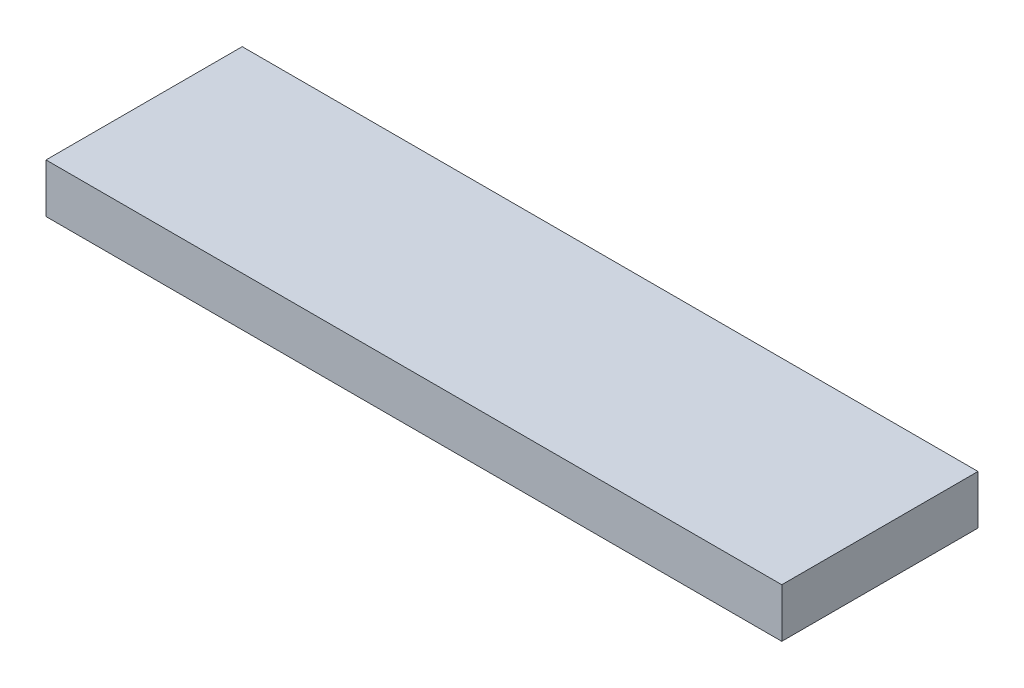
ISO-10303-21;
HEADER;
FILE_DESCRIPTION(('STEP AP214'),'2;1');
FILE_NAME('part.step','',(''),(''),'','','');
FILE_SCHEMA(('AUTOMOTIVE_DESIGN { 1 0 10303 214 1 1 1 1 }'));
ENDSEC;
DATA;
#1=APPLICATION_CONTEXT('core data for automotive mechanical design processes');
#2=APPLICATION_PROTOCOL_DEFINITION('international standard','automotive_design',2000,#1);
#3=PRODUCT_CONTEXT('',#1,'mechanical');
#4=PRODUCT('Part','Part','',(#3));
#5=PRODUCT_RELATED_PRODUCT_CATEGORY('part','',(#4));
#6=PRODUCT_DEFINITION_FORMATION('','',#4);
#7=PRODUCT_DEFINITION_CONTEXT('part definition',#1,'design');
#8=PRODUCT_DEFINITION('design','',#6,#7);
#9=PRODUCT_DEFINITION_SHAPE('','',#8);
#10=(LENGTH_UNIT() NAMED_UNIT(*) SI_UNIT(.MILLI.,.METRE.));
#11=(NAMED_UNIT(*) PLANE_ANGLE_UNIT() SI_UNIT($,.RADIAN.));
#12=(NAMED_UNIT(*) SI_UNIT($,.STERADIAN.) SOLID_ANGLE_UNIT());
#13=UNCERTAINTY_MEASURE_WITH_UNIT(LENGTH_MEASURE(1.E-05),#10,'distance_accuracy_value','');
#14=(GEOMETRIC_REPRESENTATION_CONTEXT(3) GLOBAL_UNCERTAINTY_ASSIGNED_CONTEXT((#13)) GLOBAL_UNIT_ASSIGNED_CONTEXT((#10,
#11,#12)) REPRESENTATION_CONTEXT('',''));
#15=CARTESIAN_POINT('',(0.,0.,0.));
#16=DIRECTION('',(0.,0.,1.));
#17=DIRECTION('',(1.,0.,0.));
#18=AXIS2_PLACEMENT_3D('',#15,#16,#17);
#19=CARTESIAN_POINT('',(0.,2.,0.));
#20=DIRECTION('',(1.,0.,0.));
#21=DIRECTION('',(0.,0.,-1.));
#22=AXIS2_PLACEMENT_3D('',#19,#20,#21);
#23=PLANE('',#22);
#24=DIRECTION('',(0.,0.,1.));
#25=VECTOR('',#24,1.);
#26=CARTESIAN_POINT('',(0.,0.,0.));
#27=LINE('',#26,#25);
#28=CARTESIAN_POINT('',(0.,0.,-8.));
#29=VERTEX_POINT('',#28);
#30=CARTESIAN_POINT('',(0.,0.,0.));
#31=VERTEX_POINT('',#30);
#32=EDGE_CURVE('E96',#29,#31,#27,.T.);
#33=ORIENTED_EDGE('',*,*,#32,.T.);
#34=DIRECTION('',(0.,-1.,0.));
#35=VECTOR('',#34,1.);
#36=CARTESIAN_POINT('',(0.,2.,0.));
#37=LINE('',#36,#35);
#38=CARTESIAN_POINT('',(0.,2.,0.));
#39=VERTEX_POINT('',#38);
#40=EDGE_CURVE('E11',#39,#31,#37,.T.);
#41=ORIENTED_EDGE('',*,*,#40,.F.);
#42=DIRECTION('',(0.,0.,1.));
#43=VECTOR('',#42,1.);
#44=CARTESIAN_POINT('',(0.,2.,0.));
#45=LINE('',#44,#43);
#46=CARTESIAN_POINT('',(0.,2.,-8.));
#47=VERTEX_POINT('',#46);
#48=EDGE_CURVE('E84',#47,#39,#45,.T.);
#49=ORIENTED_EDGE('',*,*,#48,.F.);
#50=DIRECTION('',(0.,-1.,0.));
#51=VECTOR('',#50,1.);
#52=CARTESIAN_POINT('',(0.,2.,-8.));
#53=LINE('',#52,#51);
#54=EDGE_CURVE('E92',#47,#29,#53,.T.);
#55=ORIENTED_EDGE('',*,*,#54,.T.);
#56=EDGE_LOOP('',(#33,#41,#49,#55));
#57=FACE_BOUND('',#56,.T.);
#58=ADVANCED_FACE('F33',(#57),#23,.F.);
#59=CARTESIAN_POINT('',(0.,2.,0.));
#60=DIRECTION('',(0.,0.,-1.));
#61=DIRECTION('',(-1.,0.,0.));
#62=AXIS2_PLACEMENT_3D('',#59,#60,#61);
#63=PLANE('',#62);
#64=DIRECTION('',(1.,0.,0.));
#65=VECTOR('',#64,1.);
#66=CARTESIAN_POINT('',(0.,0.,0.));
#67=LINE('',#66,#65);
#68=CARTESIAN_POINT('',(30.,0.,0.));
#69=VERTEX_POINT('',#68);
#70=EDGE_CURVE('E88',#31,#69,#67,.T.);
#71=ORIENTED_EDGE('',*,*,#70,.T.);
#72=DIRECTION('',(0.,-1.,0.));
#73=VECTOR('',#72,1.);
#74=CARTESIAN_POINT('',(30.,2.,0.));
#75=LINE('',#74,#73);
#76=CARTESIAN_POINT('',(30.,2.,0.));
#77=VERTEX_POINT('',#76);
#78=EDGE_CURVE('E41',#77,#69,#75,.T.);
#79=ORIENTED_EDGE('',*,*,#78,.F.);
#80=DIRECTION('',(1.,0.,0.));
#81=VECTOR('',#80,1.);
#82=CARTESIAN_POINT('',(0.,2.,0.));
#83=LINE('',#82,#81);
#84=EDGE_CURVE('E79',#39,#77,#83,.T.);
#85=ORIENTED_EDGE('',*,*,#84,.F.);
#86=ORIENTED_EDGE('',*,*,#40,.T.);
#87=EDGE_LOOP('',(#71,#79,#85,#86));
#88=FACE_BOUND('',#87,.T.);
#89=ADVANCED_FACE('F87',(#88),#63,.F.);
#90=CARTESIAN_POINT('',(30.,2.,0.));
#91=DIRECTION('',(-1.,0.,0.));
#92=DIRECTION('',(0.,0.,1.));
#93=AXIS2_PLACEMENT_3D('',#90,#91,#92);
#94=PLANE('',#93);
#95=DIRECTION('',(0.,0.,-1.));
#96=VECTOR('',#95,1.);
#97=CARTESIAN_POINT('',(30.,0.,0.));
#98=LINE('',#97,#96);
#99=CARTESIAN_POINT('',(30.,0.,-8.));
#100=VERTEX_POINT('',#99);
#101=EDGE_CURVE('E66',#69,#100,#98,.T.);
#102=ORIENTED_EDGE('',*,*,#101,.T.);
#103=DIRECTION('',(0.,-1.,0.));
#104=VECTOR('',#103,1.);
#105=CARTESIAN_POINT('',(30.,2.,-8.));
#106=LINE('',#105,#104);
#107=CARTESIAN_POINT('',(30.,2.,-8.));
#108=VERTEX_POINT('',#107);
#109=EDGE_CURVE('E89',#108,#100,#106,.T.);
#110=ORIENTED_EDGE('',*,*,#109,.F.);
#111=DIRECTION('',(0.,0.,-1.));
#112=VECTOR('',#111,1.);
#113=CARTESIAN_POINT('',(30.,2.,0.));
#114=LINE('',#113,#112);
#115=EDGE_CURVE('E82',#77,#108,#114,.T.);
#116=ORIENTED_EDGE('',*,*,#115,.F.);
#117=ORIENTED_EDGE('',*,*,#78,.T.);
#118=EDGE_LOOP('',(#102,#110,#116,#117));
#119=FACE_BOUND('',#118,.T.);
#120=ADVANCED_FACE('F90',(#119),#94,.F.);
#121=CARTESIAN_POINT('',(0.,2.,-8.));
#122=DIRECTION('',(0.,0.,1.));
#123=DIRECTION('',(1.,0.,0.));
#124=AXIS2_PLACEMENT_3D('',#121,#122,#123);
#125=PLANE('',#124);
#126=DIRECTION('',(-1.,0.,0.));
#127=VECTOR('',#126,1.);
#128=CARTESIAN_POINT('',(0.,0.,-8.));
#129=LINE('',#128,#127);
#130=EDGE_CURVE('E72',#100,#29,#129,.T.);
#131=ORIENTED_EDGE('',*,*,#130,.T.);
#132=ORIENTED_EDGE('',*,*,#54,.F.);
#133=DIRECTION('',(-1.,0.,0.));
#134=VECTOR('',#133,1.);
#135=CARTESIAN_POINT('',(0.,2.,-8.));
#136=LINE('',#135,#134);
#137=EDGE_CURVE('E49',#108,#47,#136,.T.);
#138=ORIENTED_EDGE('',*,*,#137,.F.);
#139=ORIENTED_EDGE('',*,*,#109,.T.);
#140=EDGE_LOOP('',(#131,#132,#138,#139));
#141=FACE_BOUND('',#140,.T.);
#142=ADVANCED_FACE('F103',(#141),#125,.F.);
#143=CARTESIAN_POINT('',(0.,2.,0.));
#144=DIRECTION('',(0.,-1.,0.));
#145=DIRECTION('',(0.,0.,-1.));
#146=AXIS2_PLACEMENT_3D('',#143,#144,#145);
#147=PLANE('',#146);
#148=ORIENTED_EDGE('',*,*,#48,.T.);
#149=ORIENTED_EDGE('',*,*,#84,.T.);
#150=ORIENTED_EDGE('',*,*,#115,.T.);
#151=ORIENTED_EDGE('',*,*,#137,.T.);
#152=EDGE_LOOP('',(#148,#149,#150,#151));
#153=FACE_BOUND('',#152,.T.);
#154=ADVANCED_FACE('F80',(#153),#147,.F.);
#155=CARTESIAN_POINT('',(0.,0.,0.));
#156=DIRECTION('',(0.,-1.,0.));
#157=DIRECTION('',(0.,0.,-1.));
#158=AXIS2_PLACEMENT_3D('',#155,#156,#157);
#159=PLANE('',#158);
#160=ORIENTED_EDGE('',*,*,#32,.F.);
#161=ORIENTED_EDGE('',*,*,#130,.F.);
#162=ORIENTED_EDGE('',*,*,#101,.F.);
#163=ORIENTED_EDGE('',*,*,#70,.F.);
#164=EDGE_LOOP('',(#160,#161,#162,#163));
#165=FACE_BOUND('',#164,.T.);
#166=ADVANCED_FACE('F106',(#165),#159,.T.);
#167=CLOSED_SHELL('',(#58,#89,#120,#142,#154,#166));
#168=MANIFOLD_SOLID_BREP('B2',#167);
#169=ADVANCED_BREP_SHAPE_REPRESENTATION('',(#18,#168),#14);
#170=SHAPE_DEFINITION_REPRESENTATION(#9,#169);
ENDSEC;
END-ISO-10303-21;
